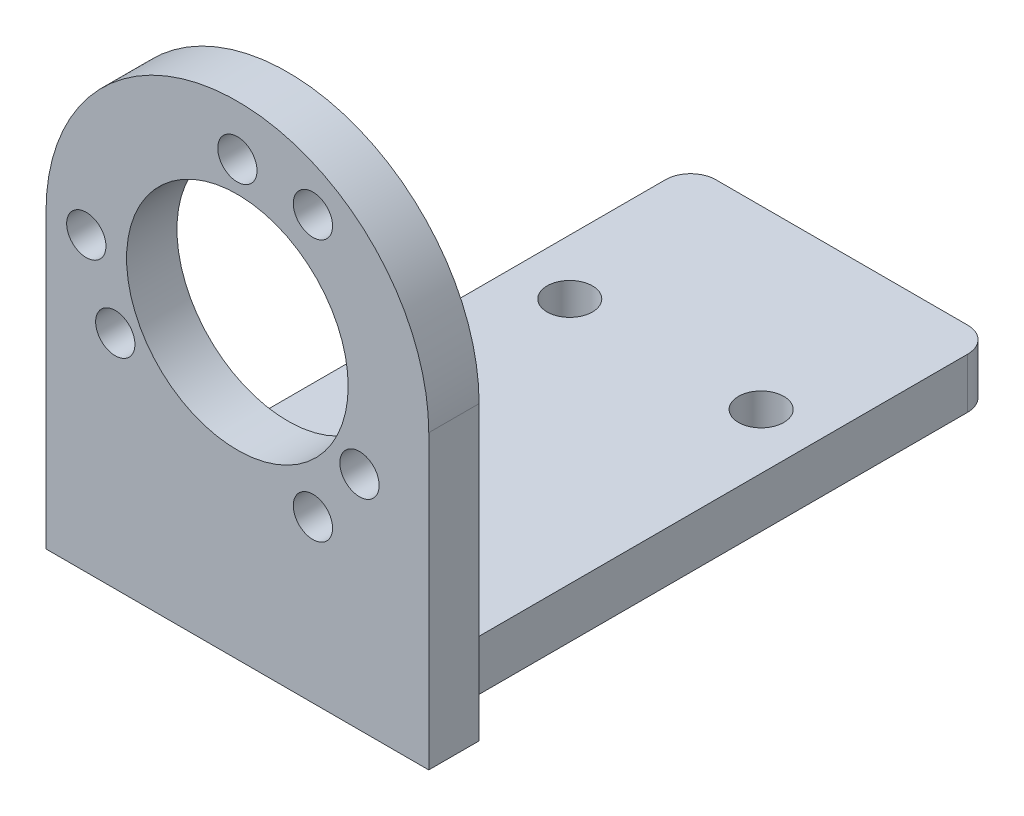
ISO-10303-21;
HEADER;
FILE_DESCRIPTION(('STEP AP214'),'2;1');
FILE_NAME('part.step','',(''),(''),'','','');
FILE_SCHEMA(('AUTOMOTIVE_DESIGN { 1 0 10303 214 1 1 1 1 }'));
ENDSEC;
DATA;
#1=APPLICATION_CONTEXT('core data for automotive mechanical design processes');
#2=APPLICATION_PROTOCOL_DEFINITION('international standard','automotive_design',2000,#1);
#3=PRODUCT_CONTEXT('',#1,'mechanical');
#4=PRODUCT('Part','Part','',(#3));
#5=PRODUCT_RELATED_PRODUCT_CATEGORY('part','',(#4));
#6=PRODUCT_DEFINITION_FORMATION('','',#4);
#7=PRODUCT_DEFINITION_CONTEXT('part definition',#1,'design');
#8=PRODUCT_DEFINITION('design','',#6,#7);
#9=PRODUCT_DEFINITION_SHAPE('','',#8);
#10=(LENGTH_UNIT() NAMED_UNIT(*) SI_UNIT(.MILLI.,.METRE.));
#11=(NAMED_UNIT(*) PLANE_ANGLE_UNIT() SI_UNIT($,.RADIAN.));
#12=(NAMED_UNIT(*) SI_UNIT($,.STERADIAN.) SOLID_ANGLE_UNIT());
#13=UNCERTAINTY_MEASURE_WITH_UNIT(LENGTH_MEASURE(1.E-05),#10,'distance_accuracy_value','');
#14=(GEOMETRIC_REPRESENTATION_CONTEXT(3) GLOBAL_UNCERTAINTY_ASSIGNED_CONTEXT((#13)) GLOBAL_UNIT_ASSIGNED_CONTEXT((#10,
#11,#12)) REPRESENTATION_CONTEXT('',''));
#15=CARTESIAN_POINT('',(0.,0.,0.));
#16=DIRECTION('',(0.,0.,1.));
#17=DIRECTION('',(1.,0.,0.));
#18=AXIS2_PLACEMENT_3D('',#15,#16,#17);
#19=CARTESIAN_POINT('',(15.,-24.,-55.));
#20=DIRECTION('',(0.,-1.,0.));
#21=DIRECTION('',(0.,0.,-1.));
#22=AXIS2_PLACEMENT_3D('',#19,#20,#21);
#23=PLANE('',#22);
#24=CARTESIAN_POINT('',(9.5,-24.,-37.5));
#25=DIRECTION('',(0.,1.,0.));
#26=DIRECTION('',(0.,0.,1.));
#27=AXIS2_PLACEMENT_3D('',#24,#25,#26);
#28=CIRCLE('',#27,2.25);
#29=CARTESIAN_POINT('',(9.5,-24.,-35.25));
#30=VERTEX_POINT('',#29);
#31=EDGE_CURVE('E234',#30,#30,#28,.T.);
#32=ORIENTED_EDGE('',*,*,#31,.F.);
#33=EDGE_LOOP('',(#32));
#34=FACE_BOUND('',#33,.T.);
#35=DIRECTION('',(1.,0.,0.));
#36=VECTOR('',#35,1.);
#37=CARTESIAN_POINT('',(15.,-24.,-55.));
#38=LINE('',#37,#36);
#39=CARTESIAN_POINT('',(-12.5,-24.,-55.));
#40=VERTEX_POINT('',#39);
#41=CARTESIAN_POINT('',(12.5,-24.,-55.));
#42=VERTEX_POINT('',#41);
#43=EDGE_CURVE('E296',#40,#42,#38,.T.);
#44=ORIENTED_EDGE('',*,*,#43,.F.);
#45=CARTESIAN_POINT('',(-12.5,-24.,-52.5));
#46=DIRECTION('',(0.,-1.,0.));
#47=DIRECTION('',(0.,0.,-1.));
#48=AXIS2_PLACEMENT_3D('',#45,#46,#47);
#49=CIRCLE('',#48,2.5);
#50=CARTESIAN_POINT('',(-15.,-24.,-52.5));
#51=VERTEX_POINT('',#50);
#52=EDGE_CURVE('E67',#40,#51,#49,.F.);
#53=ORIENTED_EDGE('',*,*,#52,.T.);
#54=DIRECTION('',(0.,0.,1.));
#55=VECTOR('',#54,1.);
#56=CARTESIAN_POINT('',(-15.,-24.,-55.));
#57=LINE('',#56,#55);
#58=CARTESIAN_POINT('',(-15.,-24.,-2.5));
#59=VERTEX_POINT('',#58);
#60=EDGE_CURVE('E303',#51,#59,#57,.T.);
#61=ORIENTED_EDGE('',*,*,#60,.T.);
#62=DIRECTION('',(1.,0.,0.));
#63=VECTOR('',#62,1.);
#64=CARTESIAN_POINT('',(15.,-24.,-2.5));
#65=LINE('',#64,#63);
#66=CARTESIAN_POINT('',(15.,-24.,-2.5));
#67=VERTEX_POINT('',#66);
#68=EDGE_CURVE('E198',#59,#67,#65,.T.);
#69=ORIENTED_EDGE('',*,*,#68,.T.);
#70=DIRECTION('',(0.,0.,1.));
#71=VECTOR('',#70,1.);
#72=CARTESIAN_POINT('',(15.,-24.,-55.));
#73=LINE('',#72,#71);
#74=CARTESIAN_POINT('',(15.,-24.,-52.5));
#75=VERTEX_POINT('',#74);
#76=EDGE_CURVE('E299',#75,#67,#73,.T.);
#77=ORIENTED_EDGE('',*,*,#76,.F.);
#78=CARTESIAN_POINT('',(12.5,-24.,-52.5));
#79=DIRECTION('',(0.,-1.,0.));
#80=DIRECTION('',(0.,0.,-1.));
#81=AXIS2_PLACEMENT_3D('',#78,#79,#80);
#82=CIRCLE('',#81,2.5);
#83=EDGE_CURVE('E59',#75,#42,#82,.F.);
#84=ORIENTED_EDGE('',*,*,#83,.T.);
#85=EDGE_LOOP('',(#44,#53,#61,#69,#77,#84));
#86=FACE_BOUND('',#85,.T.);
#87=CARTESIAN_POINT('',(-9.5,-24.,-37.5));
#88=DIRECTION('',(0.,1.,0.));
#89=DIRECTION('',(0.,0.,1.));
#90=AXIS2_PLACEMENT_3D('',#87,#88,#89);
#91=CIRCLE('',#90,2.25);
#92=CARTESIAN_POINT('',(-9.5,-24.,-35.25));
#93=VERTEX_POINT('',#92);
#94=EDGE_CURVE('E221',#93,#93,#91,.T.);
#95=ORIENTED_EDGE('',*,*,#94,.F.);
#96=EDGE_LOOP('',(#95));
#97=FACE_BOUND('',#96,.T.);
#98=ADVANCED_FACE('F41',(#34,#86,#97),#23,.F.);
#99=CARTESIAN_POINT('',(0.,0.,0.));
#100=DIRECTION('',(0.,0.,1.));
#101=DIRECTION('',(1.,0.,0.));
#102=AXIS2_PLACEMENT_3D('',#99,#100,#101);
#103=PLANE('',#102);
#104=DIRECTION('',(1.,0.,0.));
#105=VECTOR('',#104,1.);
#106=CARTESIAN_POINT('',(0.,-29.,0.));
#107=LINE('',#106,#105);
#108=CARTESIAN_POINT('',(17.5,-29.,0.));
#109=VERTEX_POINT('',#108);
#110=CARTESIAN_POINT('',(19.,-29.,0.));
#111=VERTEX_POINT('',#110);
#112=EDGE_CURVE('E333',#109,#111,#107,.T.);
#113=ORIENTED_EDGE('',*,*,#112,.F.);
#114=DIRECTION('',(0.,-1.,0.));
#115=VECTOR('',#114,1.);
#116=CARTESIAN_POINT('',(17.5,-24.,0.));
#117=LINE('',#116,#115);
#118=CARTESIAN_POINT('',(17.5,-21.5,0.));
#119=VERTEX_POINT('',#118);
#120=EDGE_CURVE('E182',#109,#119,#117,.F.);
#121=ORIENTED_EDGE('',*,*,#120,.T.);
#122=DIRECTION('',(1.,0.,0.));
#123=VECTOR('',#122,1.);
#124=CARTESIAN_POINT('',(-15.,-21.5,0.));
#125=LINE('',#124,#123);
#126=CARTESIAN_POINT('',(-17.5,-21.5,0.));
#127=VERTEX_POINT('',#126);
#128=EDGE_CURVE('E176',#119,#127,#125,.F.);
#129=ORIENTED_EDGE('',*,*,#128,.T.);
#130=DIRECTION('',(0.,1.,0.));
#131=VECTOR('',#130,1.);
#132=CARTESIAN_POINT('',(-17.5,-29.,0.));
#133=LINE('',#132,#131);
#134=CARTESIAN_POINT('',(-17.5,-29.,0.));
#135=VERTEX_POINT('',#134);
#136=EDGE_CURVE('E179',#127,#135,#133,.F.);
#137=ORIENTED_EDGE('',*,*,#136,.T.);
#138=CARTESIAN_POINT('',(-19.,-29.,0.));
#139=VERTEX_POINT('',#138);
#140=EDGE_CURVE('E334',#139,#135,#107,.T.);
#141=ORIENTED_EDGE('',*,*,#140,.F.);
#142=DIRECTION('',(0.,-1.,0.));
#143=VECTOR('',#142,1.);
#144=CARTESIAN_POINT('',(-19.,0.,0.));
#145=LINE('',#144,#143);
#146=CARTESIAN_POINT('',(-19.,0.,0.));
#147=VERTEX_POINT('',#146);
#148=EDGE_CURVE('E330',#147,#139,#145,.T.);
#149=ORIENTED_EDGE('',*,*,#148,.F.);
#150=CARTESIAN_POINT('',(0.,0.,0.));
#151=DIRECTION('',(0.,0.,1.));
#152=DIRECTION('',(1.,0.,0.));
#153=AXIS2_PLACEMENT_3D('',#150,#151,#152);
#154=CIRCLE('',#153,19.);
#155=CARTESIAN_POINT('',(19.,0.,0.));
#156=VERTEX_POINT('',#155);
#157=EDGE_CURVE('E161',#156,#147,#154,.T.);
#158=ORIENTED_EDGE('',*,*,#157,.F.);
#159=DIRECTION('',(0.,1.,0.));
#160=VECTOR('',#159,1.);
#161=CARTESIAN_POINT('',(19.,0.,0.));
#162=LINE('',#161,#160);
#163=EDGE_CURVE('E318',#111,#156,#162,.T.);
#164=ORIENTED_EDGE('',*,*,#163,.F.);
#165=EDGE_LOOP('',(#113,#121,#129,#137,#141,#149,#158,#164));
#166=FACE_BOUND('',#165,.T.);
#167=CARTESIAN_POINT('',(0.,14.,0.));
#168=DIRECTION('',(0.,0.,1.));
#169=DIRECTION('',(1.,0.,0.));
#170=AXIS2_PLACEMENT_3D('',#167,#168,#169);
#171=CIRCLE('',#170,1.95);
#172=CARTESIAN_POINT('',(1.95,14.,0.));
#173=VERTEX_POINT('',#172);
#174=EDGE_CURVE('E248',#173,#173,#171,.T.);
#175=ORIENTED_EDGE('',*,*,#174,.T.);
#176=EDGE_LOOP('',(#175));
#177=FACE_BOUND('',#176,.T.);
#178=CARTESIAN_POINT('',(12.1243556530073,-6.9999999999855,0.));
#179=DIRECTION('',(0.,0.,1.));
#180=DIRECTION('',(1.,0.,0.));
#181=AXIS2_PLACEMENT_3D('',#178,#179,#180);
#182=CIRCLE('',#181,1.95);
#183=CARTESIAN_POINT('',(14.0743556530073,-6.9999999999855,0.));
#184=VERTEX_POINT('',#183);
#185=EDGE_CURVE('E256',#184,#184,#182,.T.);
#186=ORIENTED_EDGE('',*,*,#185,.T.);
#187=EDGE_LOOP('',(#186));
#188=FACE_BOUND('',#187,.T.);
#189=CARTESIAN_POINT('',(-12.124355652957,-7.0000000000145,0.));
#190=DIRECTION('',(0.,0.,1.));
#191=DIRECTION('',(1.,0.,0.));
#192=AXIS2_PLACEMENT_3D('',#189,#190,#191);
#193=CIRCLE('',#192,1.95);
#194=CARTESIAN_POINT('',(-10.174355652957,-7.0000000000145,0.));
#195=VERTEX_POINT('',#194);
#196=EDGE_CURVE('E264',#195,#195,#193,.T.);
#197=ORIENTED_EDGE('',*,*,#196,.T.);
#198=EDGE_LOOP('',(#197));
#199=FACE_BOUND('',#198,.T.);
#200=CARTESIAN_POINT('',(7.50000000000001,12.9903810567666,0.));
#201=DIRECTION('',(0.,0.,1.));
#202=DIRECTION('',(1.,0.,0.));
#203=AXIS2_PLACEMENT_3D('',#200,#201,#202);
#204=CIRCLE('',#203,1.95);
#205=CARTESIAN_POINT('',(9.45000000000001,12.9903810567666,0.));
#206=VERTEX_POINT('',#205);
#207=EDGE_CURVE('E272',#206,#206,#204,.T.);
#208=ORIENTED_EDGE('',*,*,#207,.T.);
#209=EDGE_LOOP('',(#208));
#210=FACE_BOUND('',#209,.T.);
#211=CARTESIAN_POINT('',(7.50000000002511,-12.9903810567521,0.));
#212=DIRECTION('',(0.,0.,1.));
#213=DIRECTION('',(1.,0.,0.));
#214=AXIS2_PLACEMENT_3D('',#211,#212,#213);
#215=CIRCLE('',#214,1.95);
#216=CARTESIAN_POINT('',(9.4500000000251,-12.9903810567521,0.));
#217=VERTEX_POINT('',#216);
#218=EDGE_CURVE('E280',#217,#217,#215,.T.);
#219=ORIENTED_EDGE('',*,*,#218,.T.);
#220=EDGE_LOOP('',(#219));
#221=FACE_BOUND('',#220,.T.);
#222=CARTESIAN_POINT('',(-14.9999999999749,-1.4479901793288E-11,0.));
#223=DIRECTION('',(0.,0.,1.));
#224=DIRECTION('',(1.,0.,0.));
#225=AXIS2_PLACEMENT_3D('',#222,#223,#224);
#226=CIRCLE('',#225,1.95);
#227=CARTESIAN_POINT('',(-13.0499999999749,-1.4479901793288E-11,0.));
#228=VERTEX_POINT('',#227);
#229=EDGE_CURVE('E288',#228,#228,#226,.T.);
#230=ORIENTED_EDGE('',*,*,#229,.T.);
#231=EDGE_LOOP('',(#230));
#232=FACE_BOUND('',#231,.T.);
#233=CARTESIAN_POINT('',(0.,0.,0.));
#234=DIRECTION('',(0.,0.,1.));
#235=DIRECTION('',(1.,0.,0.));
#236=AXIS2_PLACEMENT_3D('',#233,#234,#235);
#237=CIRCLE('',#236,11.);
#238=CARTESIAN_POINT('',(11.,0.,0.));
#239=VERTEX_POINT('',#238);
#240=EDGE_CURVE('E315',#239,#239,#237,.T.);
#241=ORIENTED_EDGE('',*,*,#240,.T.);
#242=EDGE_LOOP('',(#241));
#243=FACE_BOUND('',#242,.T.);
#244=ADVANCED_FACE('F350',(#166,#177,#188,#199,#210,#221,#232,#243),#103,.F.);
#245=CARTESIAN_POINT('',(0.,0.,5.));
#246=DIRECTION('',(0.,0.,-1.));
#247=DIRECTION('',(-1.,0.,0.));
#248=AXIS2_PLACEMENT_3D('',#245,#246,#247);
#249=CYLINDRICAL_SURFACE('',#248,19.);
#250=ORIENTED_EDGE('',*,*,#157,.T.);
#251=DIRECTION('',(0.,0.,-1.));
#252=VECTOR('',#251,1.);
#253=CARTESIAN_POINT('',(-19.,0.,5.));
#254=LINE('',#253,#252);
#255=CARTESIAN_POINT('',(-19.,0.,5.));
#256=VERTEX_POINT('',#255);
#257=EDGE_CURVE('E139',#256,#147,#254,.T.);
#258=ORIENTED_EDGE('',*,*,#257,.F.);
#259=CARTESIAN_POINT('',(0.,0.,5.));
#260=DIRECTION('',(0.,0.,1.));
#261=DIRECTION('',(1.,0.,0.));
#262=AXIS2_PLACEMENT_3D('',#259,#260,#261);
#263=CIRCLE('',#262,19.);
#264=CARTESIAN_POINT('',(19.,0.,5.));
#265=VERTEX_POINT('',#264);
#266=EDGE_CURVE('E147',#265,#256,#263,.T.);
#267=ORIENTED_EDGE('',*,*,#266,.F.);
#268=DIRECTION('',(0.,0.,-1.));
#269=VECTOR('',#268,1.);
#270=CARTESIAN_POINT('',(19.,0.,5.));
#271=LINE('',#270,#269);
#272=EDGE_CURVE('E324',#265,#156,#271,.T.);
#273=ORIENTED_EDGE('',*,*,#272,.T.);
#274=EDGE_LOOP('',(#250,#258,#267,#273));
#275=FACE_BOUND('',#274,.T.);
#276=ADVANCED_FACE('F159',(#275),#249,.T.);
#277=CARTESIAN_POINT('',(-19.,0.,5.));
#278=DIRECTION('',(1.,0.,0.));
#279=DIRECTION('',(0.,1.,0.));
#280=AXIS2_PLACEMENT_3D('',#277,#278,#279);
#281=PLANE('',#280);
#282=ORIENTED_EDGE('',*,*,#148,.T.);
#283=DIRECTION('',(0.,0.,-1.));
#284=VECTOR('',#283,1.);
#285=CARTESIAN_POINT('',(-19.,-29.,5.));
#286=LINE('',#285,#284);
#287=CARTESIAN_POINT('',(-19.,-29.,5.));
#288=VERTEX_POINT('',#287);
#289=EDGE_CURVE('E142',#288,#139,#286,.T.);
#290=ORIENTED_EDGE('',*,*,#289,.F.);
#291=DIRECTION('',(0.,-1.,0.));
#292=VECTOR('',#291,1.);
#293=CARTESIAN_POINT('',(-19.,0.,5.));
#294=LINE('',#293,#292);
#295=EDGE_CURVE('E135',#256,#288,#294,.T.);
#296=ORIENTED_EDGE('',*,*,#295,.F.);
#297=ORIENTED_EDGE('',*,*,#257,.T.);
#298=EDGE_LOOP('',(#282,#290,#296,#297));
#299=FACE_BOUND('',#298,.T.);
#300=ADVANCED_FACE('F137',(#299),#281,.F.);
#301=CARTESIAN_POINT('',(0.,-29.,5.));
#302=DIRECTION('',(0.,1.,0.));
#303=DIRECTION('',(0.,0.,1.));
#304=AXIS2_PLACEMENT_3D('',#301,#302,#303);
#305=PLANE('',#304);
#306=CARTESIAN_POINT('',(-9.5,-29.,-37.5));
#307=DIRECTION('',(0.,1.,0.));
#308=DIRECTION('',(0.,0.,1.));
#309=AXIS2_PLACEMENT_3D('',#306,#307,#308);
#310=CIRCLE('',#309,2.25);
#311=CARTESIAN_POINT('',(-9.5,-29.,-35.25));
#312=VERTEX_POINT('',#311);
#313=EDGE_CURVE('E228',#312,#312,#310,.T.);
#314=ORIENTED_EDGE('',*,*,#313,.T.);
#315=EDGE_LOOP('',(#314));
#316=FACE_BOUND('',#315,.T.);
#317=CARTESIAN_POINT('',(9.5,-29.,-37.5));
#318=DIRECTION('',(0.,1.,0.));
#319=DIRECTION('',(0.,0.,1.));
#320=AXIS2_PLACEMENT_3D('',#317,#318,#319);
#321=CIRCLE('',#320,2.25);
#322=CARTESIAN_POINT('',(9.5,-29.,-35.25));
#323=VERTEX_POINT('',#322);
#324=EDGE_CURVE('E240',#323,#323,#321,.T.);
#325=ORIENTED_EDGE('',*,*,#324,.T.);
#326=EDGE_LOOP('',(#325));
#327=FACE_BOUND('',#326,.T.);
#328=DIRECTION('',(0.,0.,1.));
#329=VECTOR('',#328,1.);
#330=CARTESIAN_POINT('',(-15.,-29.,-55.));
#331=LINE('',#330,#329);
#332=CARTESIAN_POINT('',(-15.,-29.,-52.5));
#333=VERTEX_POINT('',#332);
#334=CARTESIAN_POINT('',(-15.,-29.,-2.5));
#335=VERTEX_POINT('',#334);
#336=EDGE_CURVE('E307',#333,#335,#331,.T.);
#337=ORIENTED_EDGE('',*,*,#336,.F.);
#338=CARTESIAN_POINT('',(-12.5,-29.,-52.5));
#339=DIRECTION('',(0.,1.,0.));
#340=DIRECTION('',(0.,0.,1.));
#341=AXIS2_PLACEMENT_3D('',#338,#339,#340);
#342=CIRCLE('',#341,2.5);
#343=CARTESIAN_POINT('',(-12.5,-29.,-55.));
#344=VERTEX_POINT('',#343);
#345=EDGE_CURVE('E208',#333,#344,#342,.F.);
#346=ORIENTED_EDGE('',*,*,#345,.T.);
#347=DIRECTION('',(-1.,0.,0.));
#348=VECTOR('',#347,1.);
#349=CARTESIAN_POINT('',(15.,-29.,-55.));
#350=LINE('',#349,#348);
#351=CARTESIAN_POINT('',(12.5,-29.,-55.));
#352=VERTEX_POINT('',#351);
#353=EDGE_CURVE('E292',#352,#344,#350,.T.);
#354=ORIENTED_EDGE('',*,*,#353,.F.);
#355=CARTESIAN_POINT('',(12.5,-29.,-52.5));
#356=DIRECTION('',(0.,1.,0.));
#357=DIRECTION('',(0.,0.,1.));
#358=AXIS2_PLACEMENT_3D('',#355,#356,#357);
#359=CIRCLE('',#358,2.5);
#360=CARTESIAN_POINT('',(15.,-29.,-52.5));
#361=VERTEX_POINT('',#360);
#362=EDGE_CURVE('E205',#352,#361,#359,.F.);
#363=ORIENTED_EDGE('',*,*,#362,.T.);
#364=DIRECTION('',(0.,0.,1.));
#365=VECTOR('',#364,1.);
#366=CARTESIAN_POINT('',(15.,-29.,-55.));
#367=LINE('',#366,#365);
#368=CARTESIAN_POINT('',(15.,-29.,-2.5));
#369=VERTEX_POINT('',#368);
#370=EDGE_CURVE('E311',#361,#369,#367,.T.);
#371=ORIENTED_EDGE('',*,*,#370,.T.);
#372=CARTESIAN_POINT('',(17.5,-29.,-2.5));
#373=DIRECTION('',(0.,1.,0.));
#374=DIRECTION('',(0.,0.,1.));
#375=AXIS2_PLACEMENT_3D('',#372,#373,#374);
#376=CIRCLE('',#375,2.5);
#377=EDGE_CURVE('E51',#369,#109,#376,.T.);
#378=ORIENTED_EDGE('',*,*,#377,.T.);
#379=ORIENTED_EDGE('',*,*,#112,.T.);
#380=DIRECTION('',(0.,0.,-1.));
#381=VECTOR('',#380,1.);
#382=CARTESIAN_POINT('',(19.,-29.,5.));
#383=LINE('',#382,#381);
#384=CARTESIAN_POINT('',(19.,-29.,5.));
#385=VERTEX_POINT('',#384);
#386=EDGE_CURVE('E169',#385,#111,#383,.T.);
#387=ORIENTED_EDGE('',*,*,#386,.F.);
#388=DIRECTION('',(1.,0.,0.));
#389=VECTOR('',#388,1.);
#390=CARTESIAN_POINT('',(0.,-29.,5.));
#391=LINE('',#390,#389);
#392=EDGE_CURVE('E146',#288,#385,#391,.T.);
#393=ORIENTED_EDGE('',*,*,#392,.F.);
#394=ORIENTED_EDGE('',*,*,#289,.T.);
#395=ORIENTED_EDGE('',*,*,#140,.T.);
#396=CARTESIAN_POINT('',(-17.5,-29.,-2.5));
#397=DIRECTION('',(0.,1.,0.));
#398=DIRECTION('',(0.,0.,1.));
#399=AXIS2_PLACEMENT_3D('',#396,#397,#398);
#400=CIRCLE('',#399,2.5);
#401=EDGE_CURVE('E11',#135,#335,#400,.T.);
#402=ORIENTED_EDGE('',*,*,#401,.T.);
#403=EDGE_LOOP('',(#337,#346,#354,#363,#371,#378,#379,#387,#393,#394,#395,#402));
#404=FACE_BOUND('',#403,.T.);
#405=ADVANCED_FACE('F354',(#316,#327,#404),#305,.F.);
#406=CARTESIAN_POINT('',(0.,0.,5.));
#407=DIRECTION('',(0.,0.,-1.));
#408=DIRECTION('',(-1.,0.,0.));
#409=AXIS2_PLACEMENT_3D('',#406,#407,#408);
#410=CYLINDRICAL_SURFACE('',#409,11.);
#411=CARTESIAN_POINT('',(0.,0.,5.));
#412=DIRECTION('',(0.,0.,1.));
#413=DIRECTION('',(1.,0.,0.));
#414=AXIS2_PLACEMENT_3D('',#411,#412,#413);
#415=CIRCLE('',#414,11.);
#416=CARTESIAN_POINT('',(11.,0.,5.));
#417=VERTEX_POINT('',#416);
#418=EDGE_CURVE('E157',#417,#417,#415,.T.);
#419=ORIENTED_EDGE('',*,*,#418,.T.);
#420=EDGE_LOOP('',(#419));
#421=FACE_BOUND('',#420,.T.);
#422=ORIENTED_EDGE('',*,*,#240,.F.);
#423=EDGE_LOOP('',(#422));
#424=FACE_BOUND('',#423,.T.);
#425=ADVANCED_FACE('F406',(#421,#424),#410,.F.);
#426=CARTESIAN_POINT('',(19.,0.,5.));
#427=DIRECTION('',(-1.,0.,0.));
#428=DIRECTION('',(0.,-1.,0.));
#429=AXIS2_PLACEMENT_3D('',#426,#427,#428);
#430=PLANE('',#429);
#431=ORIENTED_EDGE('',*,*,#163,.T.);
#432=ORIENTED_EDGE('',*,*,#272,.F.);
#433=DIRECTION('',(0.,1.,0.));
#434=VECTOR('',#433,1.);
#435=CARTESIAN_POINT('',(19.,0.,5.));
#436=LINE('',#435,#434);
#437=EDGE_CURVE('E152',#385,#265,#436,.T.);
#438=ORIENTED_EDGE('',*,*,#437,.F.);
#439=ORIENTED_EDGE('',*,*,#386,.T.);
#440=EDGE_LOOP('',(#431,#432,#438,#439));
#441=FACE_BOUND('',#440,.T.);
#442=ADVANCED_FACE('F346',(#441),#430,.F.);
#443=CARTESIAN_POINT('',(0.,0.,5.));
#444=DIRECTION('',(0.,0.,1.));
#445=DIRECTION('',(1.,0.,0.));
#446=AXIS2_PLACEMENT_3D('',#443,#444,#445);
#447=PLANE('',#446);
#448=CARTESIAN_POINT('',(0.,14.,5.));
#449=DIRECTION('',(0.,0.,1.));
#450=DIRECTION('',(1.,0.,0.));
#451=AXIS2_PLACEMENT_3D('',#448,#449,#450);
#452=CIRCLE('',#451,1.95);
#453=CARTESIAN_POINT('',(1.95,14.,5.));
#454=VERTEX_POINT('',#453);
#455=EDGE_CURVE('E244',#454,#454,#452,.T.);
#456=ORIENTED_EDGE('',*,*,#455,.F.);
#457=EDGE_LOOP('',(#456));
#458=FACE_BOUND('',#457,.T.);
#459=CARTESIAN_POINT('',(12.1243556530073,-6.9999999999855,5.));
#460=DIRECTION('',(0.,0.,1.));
#461=DIRECTION('',(1.,0.,0.));
#462=AXIS2_PLACEMENT_3D('',#459,#460,#461);
#463=CIRCLE('',#462,1.95);
#464=CARTESIAN_POINT('',(14.0743556530073,-6.9999999999855,5.));
#465=VERTEX_POINT('',#464);
#466=EDGE_CURVE('E252',#465,#465,#463,.T.);
#467=ORIENTED_EDGE('',*,*,#466,.F.);
#468=EDGE_LOOP('',(#467));
#469=FACE_BOUND('',#468,.T.);
#470=CARTESIAN_POINT('',(-12.124355652957,-7.0000000000145,5.));
#471=DIRECTION('',(0.,0.,1.));
#472=DIRECTION('',(1.,0.,0.));
#473=AXIS2_PLACEMENT_3D('',#470,#471,#472);
#474=CIRCLE('',#473,1.95);
#475=CARTESIAN_POINT('',(-10.174355652957,-7.0000000000145,5.));
#476=VERTEX_POINT('',#475);
#477=EDGE_CURVE('E260',#476,#476,#474,.T.);
#478=ORIENTED_EDGE('',*,*,#477,.F.);
#479=EDGE_LOOP('',(#478));
#480=FACE_BOUND('',#479,.T.);
#481=CARTESIAN_POINT('',(7.50000000000001,12.9903810567666,5.));
#482=DIRECTION('',(0.,0.,1.));
#483=DIRECTION('',(1.,0.,0.));
#484=AXIS2_PLACEMENT_3D('',#481,#482,#483);
#485=CIRCLE('',#484,1.95);
#486=CARTESIAN_POINT('',(9.45000000000001,12.9903810567666,5.));
#487=VERTEX_POINT('',#486);
#488=EDGE_CURVE('E268',#487,#487,#485,.T.);
#489=ORIENTED_EDGE('',*,*,#488,.F.);
#490=EDGE_LOOP('',(#489));
#491=FACE_BOUND('',#490,.T.);
#492=CARTESIAN_POINT('',(7.50000000002511,-12.9903810567521,5.));
#493=DIRECTION('',(0.,0.,1.));
#494=DIRECTION('',(1.,0.,0.));
#495=AXIS2_PLACEMENT_3D('',#492,#493,#494);
#496=CIRCLE('',#495,1.95);
#497=CARTESIAN_POINT('',(9.4500000000251,-12.9903810567521,5.));
#498=VERTEX_POINT('',#497);
#499=EDGE_CURVE('E276',#498,#498,#496,.T.);
#500=ORIENTED_EDGE('',*,*,#499,.F.);
#501=EDGE_LOOP('',(#500));
#502=FACE_BOUND('',#501,.T.);
#503=CARTESIAN_POINT('',(-14.9999999999749,-1.4479901793288E-11,5.));
#504=DIRECTION('',(0.,0.,1.));
#505=DIRECTION('',(1.,0.,0.));
#506=AXIS2_PLACEMENT_3D('',#503,#504,#505);
#507=CIRCLE('',#506,1.95);
#508=CARTESIAN_POINT('',(-13.0499999999749,-1.4479901793288E-11,5.));
#509=VERTEX_POINT('',#508);
#510=EDGE_CURVE('E284',#509,#509,#507,.T.);
#511=ORIENTED_EDGE('',*,*,#510,.F.);
#512=EDGE_LOOP('',(#511));
#513=FACE_BOUND('',#512,.T.);
#514=ORIENTED_EDGE('',*,*,#418,.F.);
#515=EDGE_LOOP('',(#514));
#516=FACE_BOUND('',#515,.T.);
#517=ORIENTED_EDGE('',*,*,#266,.T.);
#518=ORIENTED_EDGE('',*,*,#295,.T.);
#519=ORIENTED_EDGE('',*,*,#392,.T.);
#520=ORIENTED_EDGE('',*,*,#437,.T.);
#521=EDGE_LOOP('',(#517,#518,#519,#520));
#522=FACE_BOUND('',#521,.T.);
#523=ADVANCED_FACE('F150',(#458,#469,#480,#491,#502,#513,#516,#522),#447,.T.);
#524=CARTESIAN_POINT('',(15.,-29.,-55.));
#525=DIRECTION('',(-1.,0.,0.));
#526=DIRECTION('',(0.,0.,1.));
#527=AXIS2_PLACEMENT_3D('',#524,#525,#526);
#528=PLANE('',#527);
#529=ORIENTED_EDGE('',*,*,#76,.T.);
#530=DIRECTION('',(0.,-1.,0.));
#531=VECTOR('',#530,1.);
#532=CARTESIAN_POINT('',(15.,-29.,-2.5));
#533=LINE('',#532,#531);
#534=EDGE_CURVE('E167',#67,#369,#533,.T.);
#535=ORIENTED_EDGE('',*,*,#534,.T.);
#536=ORIENTED_EDGE('',*,*,#370,.F.);
#537=DIRECTION('',(0.,-1.,0.));
#538=VECTOR('',#537,1.);
#539=CARTESIAN_POINT('',(15.,-29.,-52.5));
#540=LINE('',#539,#538);
#541=EDGE_CURVE('E163',#361,#75,#540,.F.);
#542=ORIENTED_EDGE('',*,*,#541,.T.);
#543=EDGE_LOOP('',(#529,#535,#536,#542));
#544=FACE_BOUND('',#543,.T.);
#545=ADVANCED_FACE('F372',(#544),#528,.F.);
#546=CARTESIAN_POINT('',(-15.,-29.,-55.));
#547=DIRECTION('',(1.,0.,0.));
#548=DIRECTION('',(0.,0.,-1.));
#549=AXIS2_PLACEMENT_3D('',#546,#547,#548);
#550=PLANE('',#549);
#551=ORIENTED_EDGE('',*,*,#336,.T.);
#552=DIRECTION('',(0.,1.,0.));
#553=VECTOR('',#552,1.);
#554=CARTESIAN_POINT('',(-15.,-24.,-2.5));
#555=LINE('',#554,#553);
#556=EDGE_CURVE('E188',#335,#59,#555,.T.);
#557=ORIENTED_EDGE('',*,*,#556,.T.);
#558=ORIENTED_EDGE('',*,*,#60,.F.);
#559=DIRECTION('',(0.,1.,0.));
#560=VECTOR('',#559,1.);
#561=CARTESIAN_POINT('',(-15.,-29.,-52.5));
#562=LINE('',#561,#560);
#563=EDGE_CURVE('E185',#51,#333,#562,.F.);
#564=ORIENTED_EDGE('',*,*,#563,.T.);
#565=EDGE_LOOP('',(#551,#557,#558,#564));
#566=FACE_BOUND('',#565,.T.);
#567=ADVANCED_FACE('F362',(#566),#550,.F.);
#568=CARTESIAN_POINT('',(0.,0.,-55.));
#569=DIRECTION('',(0.,0.,1.));
#570=DIRECTION('',(1.,0.,0.));
#571=AXIS2_PLACEMENT_3D('',#568,#569,#570);
#572=PLANE('',#571);
#573=ORIENTED_EDGE('',*,*,#353,.T.);
#574=DIRECTION('',(0.,1.,0.));
#575=VECTOR('',#574,1.);
#576=CARTESIAN_POINT('',(-12.5,0.,-55.));
#577=LINE('',#576,#575);
#578=EDGE_CURVE('E195',#344,#40,#577,.T.);
#579=ORIENTED_EDGE('',*,*,#578,.T.);
#580=ORIENTED_EDGE('',*,*,#43,.T.);
#581=DIRECTION('',(0.,-1.,0.));
#582=VECTOR('',#581,1.);
#583=CARTESIAN_POINT('',(12.5,0.,-55.));
#584=LINE('',#583,#582);
#585=EDGE_CURVE('E191',#42,#352,#584,.T.);
#586=ORIENTED_EDGE('',*,*,#585,.T.);
#587=EDGE_LOOP('',(#573,#579,#580,#586));
#588=FACE_BOUND('',#587,.T.);
#589=ADVANCED_FACE('F366',(#588),#572,.F.);
#590=CARTESIAN_POINT('',(-14.9999999999749,-1.4479901793288E-11,5.));
#591=DIRECTION('',(0.,0.,1.));
#592=DIRECTION('',(1.,0.,0.));
#593=AXIS2_PLACEMENT_3D('',#590,#591,#592);
#594=CYLINDRICAL_SURFACE('',#593,1.95);
#595=ORIENTED_EDGE('',*,*,#229,.F.);
#596=EDGE_LOOP('',(#595));
#597=FACE_BOUND('',#596,.T.);
#598=ORIENTED_EDGE('',*,*,#510,.T.);
#599=EDGE_LOOP('',(#598));
#600=FACE_BOUND('',#599,.T.);
#601=ADVANCED_FACE('F449',(#597,#600),#594,.F.);
#602=CARTESIAN_POINT('',(7.50000000002511,-12.9903810567521,5.));
#603=DIRECTION('',(0.,0.,1.));
#604=DIRECTION('',(1.,0.,0.));
#605=AXIS2_PLACEMENT_3D('',#602,#603,#604);
#606=CYLINDRICAL_SURFACE('',#605,1.95);
#607=ORIENTED_EDGE('',*,*,#218,.F.);
#608=EDGE_LOOP('',(#607));
#609=FACE_BOUND('',#608,.T.);
#610=ORIENTED_EDGE('',*,*,#499,.T.);
#611=EDGE_LOOP('',(#610));
#612=FACE_BOUND('',#611,.T.);
#613=ADVANCED_FACE('F455',(#609,#612),#606,.F.);
#614=CARTESIAN_POINT('',(7.50000000000001,12.9903810567666,5.));
#615=DIRECTION('',(0.,0.,1.));
#616=DIRECTION('',(1.,0.,0.));
#617=AXIS2_PLACEMENT_3D('',#614,#615,#616);
#618=CYLINDRICAL_SURFACE('',#617,1.95);
#619=ORIENTED_EDGE('',*,*,#207,.F.);
#620=EDGE_LOOP('',(#619));
#621=FACE_BOUND('',#620,.T.);
#622=ORIENTED_EDGE('',*,*,#488,.T.);
#623=EDGE_LOOP('',(#622));
#624=FACE_BOUND('',#623,.T.);
#625=ADVANCED_FACE('F462',(#621,#624),#618,.F.);
#626=CARTESIAN_POINT('',(-12.124355652957,-7.0000000000145,5.));
#627=DIRECTION('',(0.,0.,1.));
#628=DIRECTION('',(1.,0.,0.));
#629=AXIS2_PLACEMENT_3D('',#626,#627,#628);
#630=CYLINDRICAL_SURFACE('',#629,1.95);
#631=ORIENTED_EDGE('',*,*,#196,.F.);
#632=EDGE_LOOP('',(#631));
#633=FACE_BOUND('',#632,.T.);
#634=ORIENTED_EDGE('',*,*,#477,.T.);
#635=EDGE_LOOP('',(#634));
#636=FACE_BOUND('',#635,.T.);
#637=ADVANCED_FACE('F470',(#633,#636),#630,.F.);
#638=CARTESIAN_POINT('',(12.1243556530073,-6.9999999999855,5.));
#639=DIRECTION('',(0.,0.,1.));
#640=DIRECTION('',(1.,0.,0.));
#641=AXIS2_PLACEMENT_3D('',#638,#639,#640);
#642=CYLINDRICAL_SURFACE('',#641,1.95);
#643=ORIENTED_EDGE('',*,*,#185,.F.);
#644=EDGE_LOOP('',(#643));
#645=FACE_BOUND('',#644,.T.);
#646=ORIENTED_EDGE('',*,*,#466,.T.);
#647=EDGE_LOOP('',(#646));
#648=FACE_BOUND('',#647,.T.);
#649=ADVANCED_FACE('F478',(#645,#648),#642,.F.);
#650=CARTESIAN_POINT('',(0.,14.,5.));
#651=DIRECTION('',(0.,0.,1.));
#652=DIRECTION('',(1.,0.,0.));
#653=AXIS2_PLACEMENT_3D('',#650,#651,#652);
#654=CYLINDRICAL_SURFACE('',#653,1.95);
#655=ORIENTED_EDGE('',*,*,#174,.F.);
#656=EDGE_LOOP('',(#655));
#657=FACE_BOUND('',#656,.T.);
#658=ORIENTED_EDGE('',*,*,#455,.T.);
#659=EDGE_LOOP('',(#658));
#660=FACE_BOUND('',#659,.T.);
#661=ADVANCED_FACE('F486',(#657,#660),#654,.F.);
#662=CARTESIAN_POINT('',(9.5,-24.,-37.5));
#663=DIRECTION('',(0.,1.,0.));
#664=DIRECTION('',(0.,0.,1.));
#665=AXIS2_PLACEMENT_3D('',#662,#663,#664);
#666=CYLINDRICAL_SURFACE('',#665,2.25);
#667=ORIENTED_EDGE('',*,*,#324,.F.);
#668=EDGE_LOOP('',(#667));
#669=FACE_BOUND('',#668,.T.);
#670=ORIENTED_EDGE('',*,*,#31,.T.);
#671=EDGE_LOOP('',(#670));
#672=FACE_BOUND('',#671,.T.);
#673=ADVANCED_FACE('F494',(#669,#672),#666,.F.);
#674=CARTESIAN_POINT('',(-9.5,-24.,-37.5));
#675=DIRECTION('',(0.,1.,0.));
#676=DIRECTION('',(0.,0.,1.));
#677=AXIS2_PLACEMENT_3D('',#674,#675,#676);
#678=CYLINDRICAL_SURFACE('',#677,2.25);
#679=ORIENTED_EDGE('',*,*,#313,.F.);
#680=EDGE_LOOP('',(#679));
#681=FACE_BOUND('',#680,.T.);
#682=ORIENTED_EDGE('',*,*,#94,.T.);
#683=EDGE_LOOP('',(#682));
#684=FACE_BOUND('',#683,.T.);
#685=ADVANCED_FACE('F384',(#681,#684),#678,.F.);
#686=CARTESIAN_POINT('',(-17.5,-29.,-2.5));
#687=DIRECTION('',(0.,-1.,0.));
#688=DIRECTION('',(0.,0.,-1.));
#689=AXIS2_PLACEMENT_3D('',#686,#687,#688);
#690=CYLINDRICAL_SURFACE('',#689,2.5);
#691=ORIENTED_EDGE('',*,*,#401,.F.);
#692=ORIENTED_EDGE('',*,*,#136,.F.);
#693=CARTESIAN_POINT('',(-17.5,-21.5,-2.5));
#694=DIRECTION('',(-0.707106781186547,-0.707106781186547,0.));
#695=DIRECTION('',(-0.707106781186547,0.707106781186547,0.));
#696=AXIS2_PLACEMENT_3D('',#693,#694,#695);
#697=ELLIPSE('',#696,3.53553390593274,2.5);
#698=EDGE_CURVE('E45',#59,#127,#697,.T.);
#699=ORIENTED_EDGE('',*,*,#698,.F.);
#700=ORIENTED_EDGE('',*,*,#556,.F.);
#701=EDGE_LOOP('',(#691,#692,#699,#700));
#702=FACE_BOUND('',#701,.T.);
#703=ADVANCED_FACE('F359',(#702),#690,.F.);
#704=CARTESIAN_POINT('',(15.,-21.5,-2.5));
#705=DIRECTION('',(-1.,0.,0.));
#706=DIRECTION('',(0.,0.,1.));
#707=AXIS2_PLACEMENT_3D('',#704,#705,#706);
#708=CYLINDRICAL_SURFACE('',#707,2.5);
#709=ORIENTED_EDGE('',*,*,#698,.T.);
#710=ORIENTED_EDGE('',*,*,#128,.F.);
#711=CARTESIAN_POINT('',(17.5,-21.5,-2.5));
#712=DIRECTION('',(-0.707106781186547,0.707106781186547,0.));
#713=DIRECTION('',(-0.707106781186547,-0.707106781186547,0.));
#714=AXIS2_PLACEMENT_3D('',#711,#712,#713);
#715=ELLIPSE('',#714,3.53553390593274,2.5);
#716=EDGE_CURVE('E212',#67,#119,#715,.T.);
#717=ORIENTED_EDGE('',*,*,#716,.F.);
#718=ORIENTED_EDGE('',*,*,#68,.F.);
#719=EDGE_LOOP('',(#709,#710,#717,#718));
#720=FACE_BOUND('',#719,.T.);
#721=ADVANCED_FACE('F375',(#720),#708,.F.);
#722=CARTESIAN_POINT('',(17.5,-29.,-2.5));
#723=DIRECTION('',(0.,1.,0.));
#724=DIRECTION('',(0.,0.,1.));
#725=AXIS2_PLACEMENT_3D('',#722,#723,#724);
#726=CYLINDRICAL_SURFACE('',#725,2.5);
#727=ORIENTED_EDGE('',*,*,#716,.T.);
#728=ORIENTED_EDGE('',*,*,#120,.F.);
#729=ORIENTED_EDGE('',*,*,#377,.F.);
#730=ORIENTED_EDGE('',*,*,#534,.F.);
#731=EDGE_LOOP('',(#727,#728,#729,#730));
#732=FACE_BOUND('',#731,.T.);
#733=ADVANCED_FACE('F373',(#732),#726,.F.);
#734=CARTESIAN_POINT('',(-12.5,0.,-52.5));
#735=DIRECTION('',(0.,1.,0.));
#736=DIRECTION('',(0.,0.,1.));
#737=AXIS2_PLACEMENT_3D('',#734,#735,#736);
#738=CYLINDRICAL_SURFACE('',#737,2.5);
#739=ORIENTED_EDGE('',*,*,#345,.F.);
#740=ORIENTED_EDGE('',*,*,#563,.F.);
#741=ORIENTED_EDGE('',*,*,#52,.F.);
#742=ORIENTED_EDGE('',*,*,#578,.F.);
#743=EDGE_LOOP('',(#739,#740,#741,#742));
#744=FACE_BOUND('',#743,.T.);
#745=ADVANCED_FACE('F382',(#744),#738,.T.);
#746=CARTESIAN_POINT('',(12.5,0.,-52.5));
#747=DIRECTION('',(0.,-1.,0.));
#748=DIRECTION('',(0.,0.,-1.));
#749=AXIS2_PLACEMENT_3D('',#746,#747,#748);
#750=CYLINDRICAL_SURFACE('',#749,2.5);
#751=ORIENTED_EDGE('',*,*,#83,.F.);
#752=ORIENTED_EDGE('',*,*,#541,.F.);
#753=ORIENTED_EDGE('',*,*,#362,.F.);
#754=ORIENTED_EDGE('',*,*,#585,.F.);
#755=EDGE_LOOP('',(#751,#752,#753,#754));
#756=FACE_BOUND('',#755,.T.);
#757=ADVANCED_FACE('F43',(#756),#750,.T.);
#758=CLOSED_SHELL('',(#98,#244,#276,#300,#405,#425,#442,#523,#545,#567,#589,#601,#613,#625,#637,
#649,#661,#673,#685,#703,#721,#733,#745,#757));
#759=MANIFOLD_SOLID_BREP('B2',#758);
#760=ADVANCED_BREP_SHAPE_REPRESENTATION('',(#18,#759),#14);
#761=SHAPE_DEFINITION_REPRESENTATION(#9,#760);
ENDSEC;
END-ISO-10303-21;
